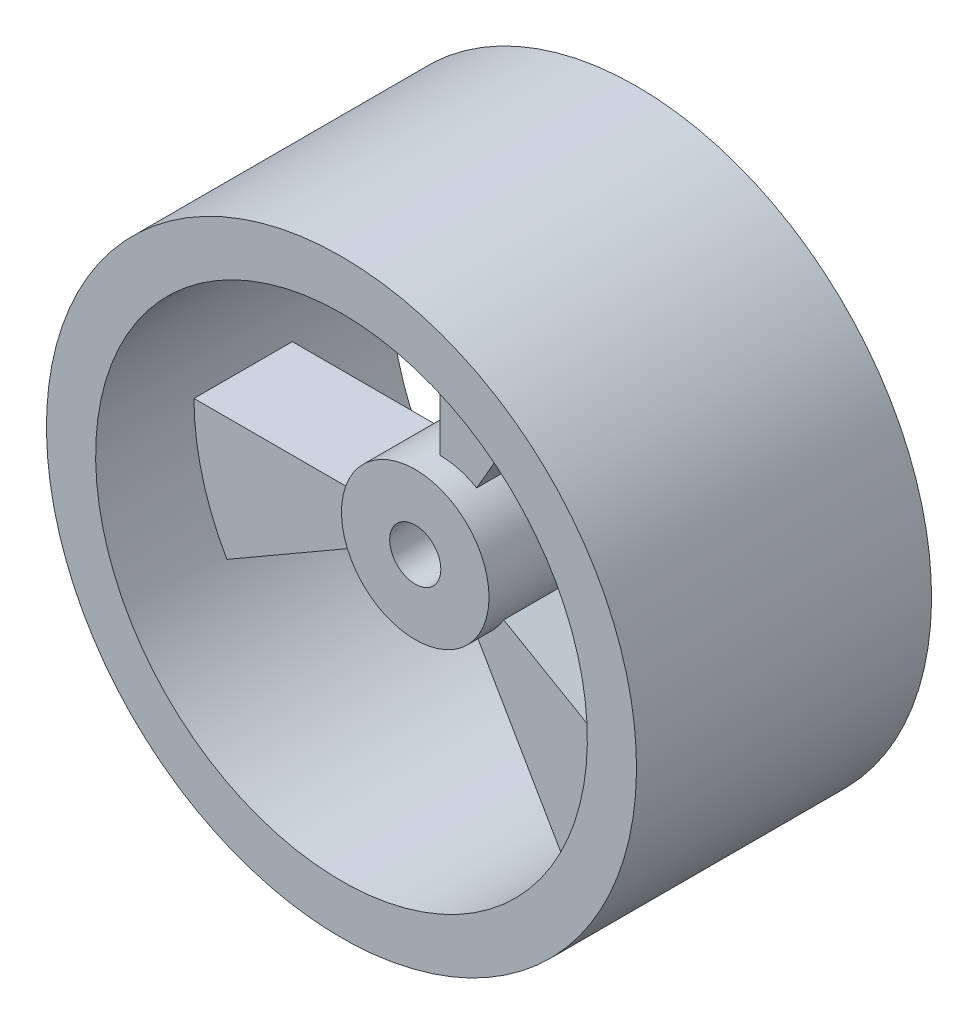
ISO-10303-21;
HEADER;
FILE_DESCRIPTION(('STEP AP214'),'2;1');
FILE_NAME('part.step','',(''),(''),'','','');
FILE_SCHEMA(('AUTOMOTIVE_DESIGN { 1 0 10303 214 1 1 1 1 }'));
ENDSEC;
DATA;
#1=APPLICATION_CONTEXT('core data for automotive mechanical design processes');
#2=APPLICATION_PROTOCOL_DEFINITION('international standard','automotive_design',2000,#1);
#3=PRODUCT_CONTEXT('',#1,'mechanical');
#4=PRODUCT('Part','Part','',(#3));
#5=PRODUCT_RELATED_PRODUCT_CATEGORY('part','',(#4));
#6=PRODUCT_DEFINITION_FORMATION('','',#4);
#7=PRODUCT_DEFINITION_CONTEXT('part definition',#1,'design');
#8=PRODUCT_DEFINITION('design','',#6,#7);
#9=PRODUCT_DEFINITION_SHAPE('','',#8);
#10=(LENGTH_UNIT() NAMED_UNIT(*) SI_UNIT(.MILLI.,.METRE.));
#11=(NAMED_UNIT(*) PLANE_ANGLE_UNIT() SI_UNIT($,.RADIAN.));
#12=(NAMED_UNIT(*) SI_UNIT($,.STERADIAN.) SOLID_ANGLE_UNIT());
#13=UNCERTAINTY_MEASURE_WITH_UNIT(LENGTH_MEASURE(1.E-05),#10,'distance_accuracy_value','');
#14=(GEOMETRIC_REPRESENTATION_CONTEXT(3) GLOBAL_UNCERTAINTY_ASSIGNED_CONTEXT((#13)) GLOBAL_UNIT_ASSIGNED_CONTEXT((#10,
#11,#12)) REPRESENTATION_CONTEXT('',''));
#15=CARTESIAN_POINT('',(0.,0.,0.));
#16=DIRECTION('',(0.,0.,1.));
#17=DIRECTION('',(1.,0.,0.));
#18=AXIS2_PLACEMENT_3D('',#15,#16,#17);
#19=CARTESIAN_POINT('',(0.,25.,-5.));
#20=DIRECTION('',(0.,0.,-1.));
#21=DIRECTION('',(0.,1.,0.));
#22=AXIS2_PLACEMENT_3D('',#19,#20,#21);
#23=PLANE('',#22);
#24=DIRECTION('',(0.499999999999992,-0.866025403784443,0.));
#25=VECTOR('',#24,1.);
#26=CARTESIAN_POINT('',(-10.8253175473054,18.7500000000002,-5.));
#27=LINE('',#26,#25);
#28=CARTESIAN_POINT('',(3.74999999999994,-6.49519052838332,-5.00000000000001));
#29=VERTEX_POINT('',#28);
#30=CARTESIAN_POINT('',(12.4999999999998,-21.6506350946111,-5.));
#31=VERTEX_POINT('',#30);
#32=EDGE_CURVE('E236',#29,#31,#27,.T.);
#33=ORIENTED_EDGE('',*,*,#32,.F.);
#34=CARTESIAN_POINT('',(0.,0.,-5.00000000000001));
#35=DIRECTION('',(0.,0.,-1.));
#36=DIRECTION('',(0.,1.,0.));
#37=AXIS2_PLACEMENT_3D('',#34,#35,#36);
#38=CIRCLE('',#37,7.5);
#39=CARTESIAN_POINT('',(6.49519052838327,-3.75000000000003,-5.00000000000001));
#40=VERTEX_POINT('',#39);
#41=EDGE_CURVE('E184',#40,#29,#38,.T.);
#42=ORIENTED_EDGE('',*,*,#41,.F.);
#43=DIRECTION('',(-0.866025481042885,0.499999866184423,0.));
#44=VECTOR('',#43,1.);
#45=CARTESIAN_POINT('',(-10.8253161952818,6.24999565099411,-5.00000000000001));
#46=LINE('',#45,#44);
#47=CARTESIAN_POINT('',(21.6506364466338,-12.4999976582275,-5.00000000000001));
#48=VERTEX_POINT('',#47);
#49=EDGE_CURVE('E241',#48,#40,#46,.T.);
#50=ORIENTED_EDGE('',*,*,#49,.F.);
#51=CARTESIAN_POINT('',(0.,0.,-5.00000000000001));
#52=DIRECTION('',(0.,0.,-1.));
#53=DIRECTION('',(0.,1.,0.));
#54=AXIS2_PLACEMENT_3D('',#51,#52,#53);
#55=CIRCLE('',#54,25.);
#56=EDGE_CURVE('E181',#48,#31,#55,.T.);
#57=ORIENTED_EDGE('',*,*,#56,.T.);
#58=EDGE_LOOP('',(#33,#42,#50,#57));
#59=FACE_BOUND('',#58,.T.);
#60=ADVANCED_FACE('F38',(#59),#23,.T.);
#61=DIRECTION('',(0.500000000000004,0.866025403784437,0.));
#62=VECTOR('',#61,1.);
#63=CARTESIAN_POINT('',(10.8253175473055,18.7499999999999,-5.));
#64=LINE('',#63,#62);
#65=CARTESIAN_POINT('',(3.75000000000003,6.49519052838328,-5.));
#66=VERTEX_POINT('',#65);
#67=CARTESIAN_POINT('',(12.5000000000001,21.650635094611,-5.));
#68=VERTEX_POINT('',#67);
#69=EDGE_CURVE('E237',#66,#68,#64,.T.);
#70=ORIENTED_EDGE('',*,*,#69,.F.);
#71=CARTESIAN_POINT('',(0.,7.5,-5.));
#72=VERTEX_POINT('',#71);
#73=EDGE_CURVE('E182',#72,#66,#38,.T.);
#74=ORIENTED_EDGE('',*,*,#73,.F.);
#75=DIRECTION('',(1.54516916920206E-07,-0.999999999999988,0.));
#76=VECTOR('',#75,1.);
#77=CARTESIAN_POINT('',(-2.70404604610357E-06,24.9999999999996,-5.));
#78=LINE('',#77,#76);
#79=CARTESIAN_POINT('',(0.,25.,-5.));
#80=VERTEX_POINT('',#79);
#81=EDGE_CURVE('E252',#80,#72,#78,.T.);
#82=ORIENTED_EDGE('',*,*,#81,.F.);
#83=EDGE_CURVE('E177',#80,#68,#55,.T.);
#84=ORIENTED_EDGE('',*,*,#83,.T.);
#85=EDGE_LOOP('',(#70,#74,#82,#84));
#86=FACE_BOUND('',#85,.T.);
#87=ADVANCED_FACE('F216',(#86),#23,.T.);
#88=CARTESIAN_POINT('',(0.,7.5,5.));
#89=DIRECTION('',(0.,0.,1.));
#90=DIRECTION('',(0.,-1.,0.));
#91=AXIS2_PLACEMENT_3D('',#88,#89,#90);
#92=PLANE('',#91);
#93=DIRECTION('',(-0.499999999999992,0.866025403784443,0.));
#94=VECTOR('',#93,1.);
#95=CARTESIAN_POINT('',(3.74999999999994,-6.49519052838332,5.));
#96=LINE('',#95,#94);
#97=CARTESIAN_POINT('',(12.4999999999998,-21.6506350946111,5.));
#98=VERTEX_POINT('',#97);
#99=CARTESIAN_POINT('',(3.74999999999994,-6.49519052838332,5.));
#100=VERTEX_POINT('',#99);
#101=EDGE_CURVE('E142',#98,#100,#96,.T.);
#102=ORIENTED_EDGE('',*,*,#101,.F.);
#103=CARTESIAN_POINT('',(0.,0.,5.));
#104=DIRECTION('',(0.,0.,-1.));
#105=DIRECTION('',(0.,1.,0.));
#106=AXIS2_PLACEMENT_3D('',#103,#104,#105);
#107=CIRCLE('',#106,25.);
#108=CARTESIAN_POINT('',(21.6506364466339,-12.4999976582275,4.99999999999999));
#109=VERTEX_POINT('',#108);
#110=EDGE_CURVE('E149',#109,#98,#107,.T.);
#111=ORIENTED_EDGE('',*,*,#110,.F.);
#112=DIRECTION('',(0.866025481042884,-0.499999866184423,0.));
#113=VECTOR('',#112,1.);
#114=CARTESIAN_POINT('',(6.49519052838327,-3.75000000000003,5.));
#115=LINE('',#114,#113);
#116=CARTESIAN_POINT('',(6.49519052838327,-3.75000000000003,5.));
#117=VERTEX_POINT('',#116);
#118=EDGE_CURVE('E269',#117,#109,#115,.T.);
#119=ORIENTED_EDGE('',*,*,#118,.F.);
#120=CARTESIAN_POINT('',(0.,0.,5.));
#121=DIRECTION('',(0.,0.,-1.));
#122=DIRECTION('',(0.,1.,0.));
#123=AXIS2_PLACEMENT_3D('',#120,#121,#122);
#124=CIRCLE('',#123,7.5);
#125=EDGE_CURVE('E155',#117,#100,#124,.T.);
#126=ORIENTED_EDGE('',*,*,#125,.T.);
#127=EDGE_LOOP('',(#102,#111,#119,#126));
#128=FACE_BOUND('',#127,.T.);
#129=ADVANCED_FACE('F211',(#128),#92,.T.);
#130=DIRECTION('',(-0.500000000000004,-0.866025403784437,0.));
#131=VECTOR('',#130,1.);
#132=CARTESIAN_POINT('',(3.75000000000003,6.49519052838327,5.));
#133=LINE('',#132,#131);
#134=CARTESIAN_POINT('',(12.5000000000001,21.650635094611,5.));
#135=VERTEX_POINT('',#134);
#136=CARTESIAN_POINT('',(3.75000000000003,6.49519052838327,5.));
#137=VERTEX_POINT('',#136);
#138=EDGE_CURVE('E285',#135,#137,#133,.T.);
#139=ORIENTED_EDGE('',*,*,#138,.F.);
#140=CARTESIAN_POINT('',(-2.70404604610364E-06,25.,5.));
#141=VERTEX_POINT('',#140);
#142=EDGE_CURVE('E152',#141,#135,#107,.T.);
#143=ORIENTED_EDGE('',*,*,#142,.F.);
#144=DIRECTION('',(-1.54516916920206E-07,0.999999999999988,0.));
#145=VECTOR('',#144,1.);
#146=CARTESIAN_POINT('',(0.,7.5,5.));
#147=LINE('',#146,#145);
#148=CARTESIAN_POINT('',(0.,7.5,5.));
#149=VERTEX_POINT('',#148);
#150=EDGE_CURVE('E239',#149,#141,#147,.T.);
#151=ORIENTED_EDGE('',*,*,#150,.F.);
#152=EDGE_CURVE('E150',#149,#137,#124,.T.);
#153=ORIENTED_EDGE('',*,*,#152,.T.);
#154=EDGE_LOOP('',(#139,#143,#151,#153));
#155=FACE_BOUND('',#154,.T.);
#156=ADVANCED_FACE('F204',(#155),#92,.T.);
#157=CARTESIAN_POINT('',(0.,7.5,7.5));
#158=DIRECTION('',(0.,0.,1.));
#159=DIRECTION('',(0.,-1.,0.));
#160=AXIS2_PLACEMENT_3D('',#157,#158,#159);
#161=PLANE('',#160);
#162=CARTESIAN_POINT('',(0.,0.,7.5));
#163=DIRECTION('',(0.,0.,1.));
#164=DIRECTION('',(0.,-1.,0.));
#165=AXIS2_PLACEMENT_3D('',#162,#163,#164);
#166=CIRCLE('',#165,2.6);
#167=CARTESIAN_POINT('',(0.,-2.6,7.5));
#168=VERTEX_POINT('',#167);
#169=EDGE_CURVE('E143',#168,#168,#166,.T.);
#170=ORIENTED_EDGE('',*,*,#169,.F.);
#171=EDGE_LOOP('',(#170));
#172=FACE_BOUND('',#171,.T.);
#173=CARTESIAN_POINT('',(0.,0.,7.5));
#174=DIRECTION('',(0.,0.,-1.));
#175=DIRECTION('',(0.,1.,0.));
#176=AXIS2_PLACEMENT_3D('',#173,#174,#175);
#177=CIRCLE('',#176,7.5);
#178=CARTESIAN_POINT('',(0.,7.5,7.5));
#179=VERTEX_POINT('',#178);
#180=EDGE_CURVE('E11',#179,#179,#177,.T.);
#181=ORIENTED_EDGE('',*,*,#180,.F.);
#182=EDGE_LOOP('',(#181));
#183=FACE_BOUND('',#182,.T.);
#184=ADVANCED_FACE('F40',(#172,#183),#161,.T.);
#185=CARTESIAN_POINT('',(0.,7.5,-7.5));
#186=DIRECTION('',(0.,0.,-1.));
#187=DIRECTION('',(0.,1.,0.));
#188=AXIS2_PLACEMENT_3D('',#185,#186,#187);
#189=PLANE('',#188);
#190=CARTESIAN_POINT('',(0.,0.,-7.5));
#191=DIRECTION('',(0.,0.,-1.));
#192=DIRECTION('',(0.,1.,0.));
#193=AXIS2_PLACEMENT_3D('',#190,#191,#192);
#194=CIRCLE('',#193,2.6);
#195=CARTESIAN_POINT('',(0.,2.6,-7.5));
#196=VERTEX_POINT('',#195);
#197=EDGE_CURVE('E521',#196,#196,#194,.T.);
#198=ORIENTED_EDGE('',*,*,#197,.F.);
#199=EDGE_LOOP('',(#198));
#200=FACE_BOUND('',#199,.T.);
#201=CARTESIAN_POINT('',(0.,0.,-7.5));
#202=DIRECTION('',(0.,0.,-1.));
#203=DIRECTION('',(0.,1.,0.));
#204=AXIS2_PLACEMENT_3D('',#201,#202,#203);
#205=CIRCLE('',#204,7.5);
#206=CARTESIAN_POINT('',(0.,7.5,-7.5));
#207=VERTEX_POINT('',#206);
#208=EDGE_CURVE('E46',#207,#207,#205,.T.);
#209=ORIENTED_EDGE('',*,*,#208,.T.);
#210=EDGE_LOOP('',(#209));
#211=FACE_BOUND('',#210,.T.);
#212=ADVANCED_FACE('F188',(#200,#211),#189,.T.);
#213=CARTESIAN_POINT('',(0.,0.,-11.4520148299988));
#214=DIRECTION('',(0.,0.,-1.));
#215=DIRECTION('',(0.,1.,0.));
#216=AXIS2_PLACEMENT_3D('',#213,#214,#215);
#217=CYLINDRICAL_SURFACE('',#216,7.5);
#218=ORIENTED_EDGE('',*,*,#41,.T.);
#219=DIRECTION('',(0.,0.,1.));
#220=VECTOR('',#219,1.);
#221=CARTESIAN_POINT('',(3.74999999999994,-6.49519052838332,-15.));
#222=LINE('',#221,#220);
#223=EDGE_CURVE('E274',#29,#100,#222,.T.);
#224=ORIENTED_EDGE('',*,*,#223,.T.);
#225=ORIENTED_EDGE('',*,*,#125,.F.);
#226=DIRECTION('',(0.,0.,1.));
#227=VECTOR('',#226,1.);
#228=CARTESIAN_POINT('',(6.49519052838327,-3.75000000000003,-15.));
#229=LINE('',#228,#227);
#230=EDGE_CURVE('E272',#40,#117,#229,.T.);
#231=ORIENTED_EDGE('',*,*,#230,.F.);
#232=EDGE_LOOP('',(#218,#224,#225,#231));
#233=FACE_BOUND('',#232,.T.);
#234=ORIENTED_EDGE('',*,*,#208,.F.);
#235=EDGE_LOOP('',(#234));
#236=FACE_BOUND('',#235,.T.);
#237=ORIENTED_EDGE('',*,*,#73,.T.);
#238=DIRECTION('',(0.,0.,1.));
#239=VECTOR('',#238,1.);
#240=CARTESIAN_POINT('',(3.75000000000003,6.49519052838328,-15.));
#241=LINE('',#240,#239);
#242=EDGE_CURVE('E288',#66,#137,#241,.T.);
#243=ORIENTED_EDGE('',*,*,#242,.T.);
#244=ORIENTED_EDGE('',*,*,#152,.F.);
#245=DIRECTION('',(0.,0.,1.));
#246=VECTOR('',#245,1.);
#247=CARTESIAN_POINT('',(0.,7.5,-15.));
#248=LINE('',#247,#246);
#249=EDGE_CURVE('E248',#72,#149,#248,.T.);
#250=ORIENTED_EDGE('',*,*,#249,.F.);
#251=EDGE_LOOP('',(#237,#243,#244,#250));
#252=FACE_BOUND('',#251,.T.);
#253=DIRECTION('',(0.,0.,1.));
#254=VECTOR('',#253,1.);
#255=CARTESIAN_POINT('',(-6.49519052838332,-3.74999999999993,-15.));
#256=LINE('',#255,#254);
#257=CARTESIAN_POINT('',(-6.49519052838332,-3.74999999999994,-5.00000000000001));
#258=VERTEX_POINT('',#257);
#259=CARTESIAN_POINT('',(-6.49519052838333,-3.74999999999994,5.));
#260=VERTEX_POINT('',#259);
#261=EDGE_CURVE('E134',#258,#260,#256,.T.);
#262=ORIENTED_EDGE('',*,*,#261,.F.);
#263=CARTESIAN_POINT('',(-7.5,0.,-5.00000000000001));
#264=VERTEX_POINT('',#263);
#265=EDGE_CURVE('E180',#258,#264,#38,.T.);
#266=ORIENTED_EDGE('',*,*,#265,.T.);
#267=DIRECTION('',(0.,0.,1.));
#268=VECTOR('',#267,1.);
#269=CARTESIAN_POINT('',(-7.5,0.,-15.));
#270=LINE('',#269,#268);
#271=CARTESIAN_POINT('',(-7.5,0.,5.));
#272=VERTEX_POINT('',#271);
#273=EDGE_CURVE('E249',#264,#272,#270,.T.);
#274=ORIENTED_EDGE('',*,*,#273,.T.);
#275=EDGE_CURVE('E157',#260,#272,#124,.T.);
#276=ORIENTED_EDGE('',*,*,#275,.F.);
#277=EDGE_LOOP('',(#262,#266,#274,#276));
#278=FACE_BOUND('',#277,.T.);
#279=ORIENTED_EDGE('',*,*,#180,.T.);
#280=EDGE_LOOP('',(#279));
#281=FACE_BOUND('',#280,.T.);
#282=ADVANCED_FACE('F190',(#233,#236,#252,#278,#281),#217,.T.);
#283=DIRECTION('',(0.866025326525975,0.500000133815561,0.));
#284=VECTOR('',#283,1.);
#285=CARTESIAN_POINT('',(10.8253188993277,6.25000434900621,-5.00000000000001));
#286=LINE('',#285,#284);
#287=CARTESIAN_POINT('',(-21.6506337425879,-12.5000023417723,-5.00000000000001));
#288=VERTEX_POINT('',#287);
#289=EDGE_CURVE('E233',#288,#258,#286,.T.);
#290=ORIENTED_EDGE('',*,*,#289,.F.);
#291=CARTESIAN_POINT('',(-25.0000000000001,0.,-5.));
#292=VERTEX_POINT('',#291);
#293=EDGE_CURVE('E132',#288,#292,#55,.T.);
#294=ORIENTED_EDGE('',*,*,#293,.T.);
#295=DIRECTION('',(-1.,0.,0.));
#296=VECTOR('',#295,1.);
#297=CARTESIAN_POINT('',(0.,0.,-5.00000000000001));
#298=LINE('',#297,#296);
#299=EDGE_CURVE('E259',#264,#292,#298,.T.);
#300=ORIENTED_EDGE('',*,*,#299,.F.);
#301=ORIENTED_EDGE('',*,*,#265,.F.);
#302=EDGE_LOOP('',(#290,#294,#300,#301));
#303=FACE_BOUND('',#302,.T.);
#304=ADVANCED_FACE('F193',(#303),#23,.T.);
#305=CARTESIAN_POINT('',(0.,30.,-15.));
#306=DIRECTION('',(0.,0.,-1.));
#307=DIRECTION('',(0.,1.,0.));
#308=AXIS2_PLACEMENT_3D('',#305,#306,#307);
#309=PLANE('',#308);
#310=CARTESIAN_POINT('',(0.,0.,-15.));
#311=DIRECTION('',(0.,0.,-1.));
#312=DIRECTION('',(0.,1.,0.));
#313=AXIS2_PLACEMENT_3D('',#310,#311,#312);
#314=CIRCLE('',#313,30.);
#315=CARTESIAN_POINT('',(0.,30.,-15.));
#316=VERTEX_POINT('',#315);
#317=EDGE_CURVE('E169',#316,#316,#314,.T.);
#318=ORIENTED_EDGE('',*,*,#317,.T.);
#319=EDGE_LOOP('',(#318));
#320=FACE_BOUND('',#319,.T.);
#321=CARTESIAN_POINT('',(0.,0.,-15.));
#322=DIRECTION('',(0.,0.,-1.));
#323=DIRECTION('',(0.,1.,0.));
#324=AXIS2_PLACEMENT_3D('',#321,#322,#323);
#325=CIRCLE('',#324,25.);
#326=CARTESIAN_POINT('',(0.,25.,-15.));
#327=VERTEX_POINT('',#326);
#328=EDGE_CURVE('E174',#327,#327,#325,.T.);
#329=ORIENTED_EDGE('',*,*,#328,.F.);
#330=EDGE_LOOP('',(#329));
#331=FACE_BOUND('',#330,.T.);
#332=ADVANCED_FACE('F226',(#320,#331),#309,.T.);
#333=CARTESIAN_POINT('',(0.,0.,-11.4520148299988));
#334=DIRECTION('',(0.,0.,-1.));
#335=DIRECTION('',(0.,1.,0.));
#336=AXIS2_PLACEMENT_3D('',#333,#334,#335);
#337=CYLINDRICAL_SURFACE('',#336,30.);
#338=CARTESIAN_POINT('',(0.,0.,15.));
#339=DIRECTION('',(0.,0.,-1.));
#340=DIRECTION('',(0.,1.,0.));
#341=AXIS2_PLACEMENT_3D('',#338,#339,#340);
#342=CIRCLE('',#341,30.);
#343=CARTESIAN_POINT('',(0.,30.,15.));
#344=VERTEX_POINT('',#343);
#345=EDGE_CURVE('E165',#344,#344,#342,.T.);
#346=ORIENTED_EDGE('',*,*,#345,.T.);
#347=EDGE_LOOP('',(#346));
#348=FACE_BOUND('',#347,.T.);
#349=ORIENTED_EDGE('',*,*,#317,.F.);
#350=EDGE_LOOP('',(#349));
#351=FACE_BOUND('',#350,.T.);
#352=ADVANCED_FACE('F231',(#348,#351),#337,.T.);
#353=CARTESIAN_POINT('',(0.,25.,15.));
#354=DIRECTION('',(0.,0.,1.));
#355=DIRECTION('',(0.,-1.,0.));
#356=AXIS2_PLACEMENT_3D('',#353,#354,#355);
#357=PLANE('',#356);
#358=CARTESIAN_POINT('',(0.,0.,15.));
#359=DIRECTION('',(0.,0.,-1.));
#360=DIRECTION('',(0.,1.,0.));
#361=AXIS2_PLACEMENT_3D('',#358,#359,#360);
#362=CIRCLE('',#361,25.);
#363=CARTESIAN_POINT('',(0.,25.,15.));
#364=VERTEX_POINT('',#363);
#365=EDGE_CURVE('E160',#364,#364,#362,.T.);
#366=ORIENTED_EDGE('',*,*,#365,.T.);
#367=EDGE_LOOP('',(#366));
#368=FACE_BOUND('',#367,.T.);
#369=ORIENTED_EDGE('',*,*,#345,.F.);
#370=EDGE_LOOP('',(#369));
#371=FACE_BOUND('',#370,.T.);
#372=ADVANCED_FACE('F298',(#368,#371),#357,.T.);
#373=CARTESIAN_POINT('',(0.,0.,-11.4520148299988));
#374=DIRECTION('',(0.,0.,-1.));
#375=DIRECTION('',(0.,1.,0.));
#376=AXIS2_PLACEMENT_3D('',#373,#374,#375);
#377=CYLINDRICAL_SURFACE('',#376,25.);
#378=ORIENTED_EDGE('',*,*,#293,.F.);
#379=DIRECTION('',(0.,0.,1.));
#380=VECTOR('',#379,1.);
#381=CARTESIAN_POINT('',(-21.650633742588,-12.5000023417724,-15.));
#382=LINE('',#381,#380);
#383=CARTESIAN_POINT('',(-21.6506337425881,-12.5000023417724,4.99999999999999));
#384=VERTEX_POINT('',#383);
#385=EDGE_CURVE('E53',#288,#384,#382,.T.);
#386=ORIENTED_EDGE('',*,*,#385,.T.);
#387=CARTESIAN_POINT('',(-25.,0.,5.));
#388=VERTEX_POINT('',#387);
#389=EDGE_CURVE('E130',#384,#388,#107,.T.);
#390=ORIENTED_EDGE('',*,*,#389,.T.);
#391=DIRECTION('',(0.,0.,1.));
#392=VECTOR('',#391,1.);
#393=CARTESIAN_POINT('',(-25.0000000000001,0.,-15.));
#394=LINE('',#393,#392);
#395=EDGE_CURVE('E253',#292,#388,#394,.T.);
#396=ORIENTED_EDGE('',*,*,#395,.F.);
#397=EDGE_LOOP('',(#378,#386,#390,#396));
#398=FACE_BOUND('',#397,.T.);
#399=ORIENTED_EDGE('',*,*,#56,.F.);
#400=DIRECTION('',(0.,0.,1.));
#401=VECTOR('',#400,1.);
#402=CARTESIAN_POINT('',(21.6506364466339,-12.4999976582275,-15.));
#403=LINE('',#402,#401);
#404=EDGE_CURVE('E61',#48,#109,#403,.T.);
#405=ORIENTED_EDGE('',*,*,#404,.T.);
#406=ORIENTED_EDGE('',*,*,#110,.T.);
#407=DIRECTION('',(0.,0.,1.));
#408=VECTOR('',#407,1.);
#409=CARTESIAN_POINT('',(12.4999999999998,-21.6506350946111,-15.));
#410=LINE('',#409,#408);
#411=EDGE_CURVE('E133',#31,#98,#410,.T.);
#412=ORIENTED_EDGE('',*,*,#411,.F.);
#413=EDGE_LOOP('',(#399,#405,#406,#412));
#414=FACE_BOUND('',#413,.T.);
#415=ORIENTED_EDGE('',*,*,#328,.T.);
#416=EDGE_LOOP('',(#415));
#417=FACE_BOUND('',#416,.T.);
#418=DIRECTION('',(0.,0.,1.));
#419=VECTOR('',#418,1.);
#420=CARTESIAN_POINT('',(12.5000000000001,21.650635094611,-15.));
#421=LINE('',#420,#419);
#422=EDGE_CURVE('E290',#68,#135,#421,.T.);
#423=ORIENTED_EDGE('',*,*,#422,.F.);
#424=ORIENTED_EDGE('',*,*,#83,.F.);
#425=DIRECTION('',(0.,0.,1.));
#426=VECTOR('',#425,1.);
#427=CARTESIAN_POINT('',(-2.70404604610364E-06,25.,-15.));
#428=LINE('',#427,#426);
#429=EDGE_CURVE('E255',#80,#141,#428,.T.);
#430=ORIENTED_EDGE('',*,*,#429,.T.);
#431=ORIENTED_EDGE('',*,*,#142,.T.);
#432=EDGE_LOOP('',(#423,#424,#430,#431));
#433=FACE_BOUND('',#432,.T.);
#434=ORIENTED_EDGE('',*,*,#365,.F.);
#435=EDGE_LOOP('',(#434));
#436=FACE_BOUND('',#435,.T.);
#437=ADVANCED_FACE('F126',(#398,#414,#417,#433,#436),#377,.F.);
#438=DIRECTION('',(-0.866025326525974,-0.500000133815561,0.));
#439=VECTOR('',#438,1.);
#440=CARTESIAN_POINT('',(-6.49519052838332,-3.74999999999994,5.));
#441=LINE('',#440,#439);
#442=EDGE_CURVE('E137',#260,#384,#441,.T.);
#443=ORIENTED_EDGE('',*,*,#442,.F.);
#444=ORIENTED_EDGE('',*,*,#275,.T.);
#445=DIRECTION('',(1.,0.,0.));
#446=VECTOR('',#445,1.);
#447=CARTESIAN_POINT('',(-7.5,0.,5.));
#448=LINE('',#447,#446);
#449=EDGE_CURVE('E148',#388,#272,#448,.T.);
#450=ORIENTED_EDGE('',*,*,#449,.F.);
#451=ORIENTED_EDGE('',*,*,#389,.F.);
#452=EDGE_LOOP('',(#443,#444,#450,#451));
#453=FACE_BOUND('',#452,.T.);
#454=ADVANCED_FACE('F146',(#453),#92,.T.);
#455=CARTESIAN_POINT('',(-7.5,0.,-15.));
#456=DIRECTION('',(0.,-1.,0.));
#457=DIRECTION('',(1.,0.,0.));
#458=AXIS2_PLACEMENT_3D('',#455,#456,#457);
#459=PLANE('',#458);
#460=ORIENTED_EDGE('',*,*,#299,.T.);
#461=ORIENTED_EDGE('',*,*,#395,.T.);
#462=ORIENTED_EDGE('',*,*,#449,.T.);
#463=ORIENTED_EDGE('',*,*,#273,.F.);
#464=EDGE_LOOP('',(#460,#461,#462,#463));
#465=FACE_BOUND('',#464,.T.);
#466=ADVANCED_FACE('F319',(#465),#459,.F.);
#467=CARTESIAN_POINT('',(0.,7.5,-15.));
#468=DIRECTION('',(0.999999999999988,1.54516916920206E-07,0.));
#469=DIRECTION('',(-1.54516916920206E-07,0.999999999999988,0.));
#470=AXIS2_PLACEMENT_3D('',#467,#468,#469);
#471=PLANE('',#470);
#472=ORIENTED_EDGE('',*,*,#81,.T.);
#473=ORIENTED_EDGE('',*,*,#249,.T.);
#474=ORIENTED_EDGE('',*,*,#150,.T.);
#475=ORIENTED_EDGE('',*,*,#429,.F.);
#476=EDGE_LOOP('',(#472,#473,#474,#475));
#477=FACE_BOUND('',#476,.T.);
#478=ADVANCED_FACE('F308',(#477),#471,.F.);
#479=CARTESIAN_POINT('',(3.75000000000003,6.49519052838328,-15.));
#480=DIRECTION('',(-0.866025403784437,0.500000000000004,0.));
#481=DIRECTION('',(-0.500000000000004,-0.866025403784437,0.));
#482=AXIS2_PLACEMENT_3D('',#479,#480,#481);
#483=PLANE('',#482);
#484=ORIENTED_EDGE('',*,*,#69,.T.);
#485=ORIENTED_EDGE('',*,*,#422,.T.);
#486=ORIENTED_EDGE('',*,*,#138,.T.);
#487=ORIENTED_EDGE('',*,*,#242,.F.);
#488=EDGE_LOOP('',(#484,#485,#486,#487));
#489=FACE_BOUND('',#488,.T.);
#490=ADVANCED_FACE('F311',(#489),#483,.F.);
#491=CARTESIAN_POINT('',(6.49519052838327,-3.75000000000003,-15.));
#492=DIRECTION('',(-0.499999866184423,-0.866025481042884,0.));
#493=DIRECTION('',(0.866025481042885,-0.499999866184423,0.));
#494=AXIS2_PLACEMENT_3D('',#491,#492,#493);
#495=PLANE('',#494);
#496=ORIENTED_EDGE('',*,*,#49,.T.);
#497=ORIENTED_EDGE('',*,*,#230,.T.);
#498=ORIENTED_EDGE('',*,*,#118,.T.);
#499=ORIENTED_EDGE('',*,*,#404,.F.);
#500=EDGE_LOOP('',(#496,#497,#498,#499));
#501=FACE_BOUND('',#500,.T.);
#502=ADVANCED_FACE('F293',(#501),#495,.F.);
#503=CARTESIAN_POINT('',(3.74999999999994,-6.49519052838332,-15.));
#504=DIRECTION('',(0.866025403784443,0.499999999999992,0.));
#505=DIRECTION('',(-0.499999999999992,0.866025403784443,0.));
#506=AXIS2_PLACEMENT_3D('',#503,#504,#505);
#507=PLANE('',#506);
#508=ORIENTED_EDGE('',*,*,#32,.T.);
#509=ORIENTED_EDGE('',*,*,#411,.T.);
#510=ORIENTED_EDGE('',*,*,#101,.T.);
#511=ORIENTED_EDGE('',*,*,#223,.F.);
#512=EDGE_LOOP('',(#508,#509,#510,#511));
#513=FACE_BOUND('',#512,.T.);
#514=ADVANCED_FACE('F277',(#513),#507,.F.);
#515=CARTESIAN_POINT('',(-6.49519052838332,-3.74999999999993,-15.));
#516=DIRECTION('',(-0.500000133815561,0.866025326525975,0.));
#517=DIRECTION('',(-0.866025326525975,-0.500000133815561,0.));
#518=AXIS2_PLACEMENT_3D('',#515,#516,#517);
#519=PLANE('',#518);
#520=ORIENTED_EDGE('',*,*,#289,.T.);
#521=ORIENTED_EDGE('',*,*,#261,.T.);
#522=ORIENTED_EDGE('',*,*,#442,.T.);
#523=ORIENTED_EDGE('',*,*,#385,.F.);
#524=EDGE_LOOP('',(#520,#521,#522,#523));
#525=FACE_BOUND('',#524,.T.);
#526=ADVANCED_FACE('F138',(#525),#519,.F.);
#527=CARTESIAN_POINT('',(0.,0.,15.));
#528=DIRECTION('',(0.,0.,-1.));
#529=DIRECTION('',(0.,1.,0.));
#530=AXIS2_PLACEMENT_3D('',#527,#528,#529);
#531=CYLINDRICAL_SURFACE('',#530,2.6);
#532=ORIENTED_EDGE('',*,*,#169,.T.);
#533=EDGE_LOOP('',(#532));
#534=FACE_BOUND('',#533,.T.);
#535=ORIENTED_EDGE('',*,*,#197,.T.);
#536=EDGE_LOOP('',(#535));
#537=FACE_BOUND('',#536,.T.);
#538=ADVANCED_FACE('F478',(#534,#537),#531,.F.);
#539=CLOSED_SHELL('',(#60,#87,#129,#156,#184,#212,#282,#304,#332,#352,#372,#437,#454,#466,#478,
#490,#502,#514,#526,#538));
#540=MANIFOLD_SOLID_BREP('B2',#539);
#541=ADVANCED_BREP_SHAPE_REPRESENTATION('',(#18,#540),#14);
#542=SHAPE_DEFINITION_REPRESENTATION(#9,#541);
ENDSEC;
END-ISO-10303-21;
